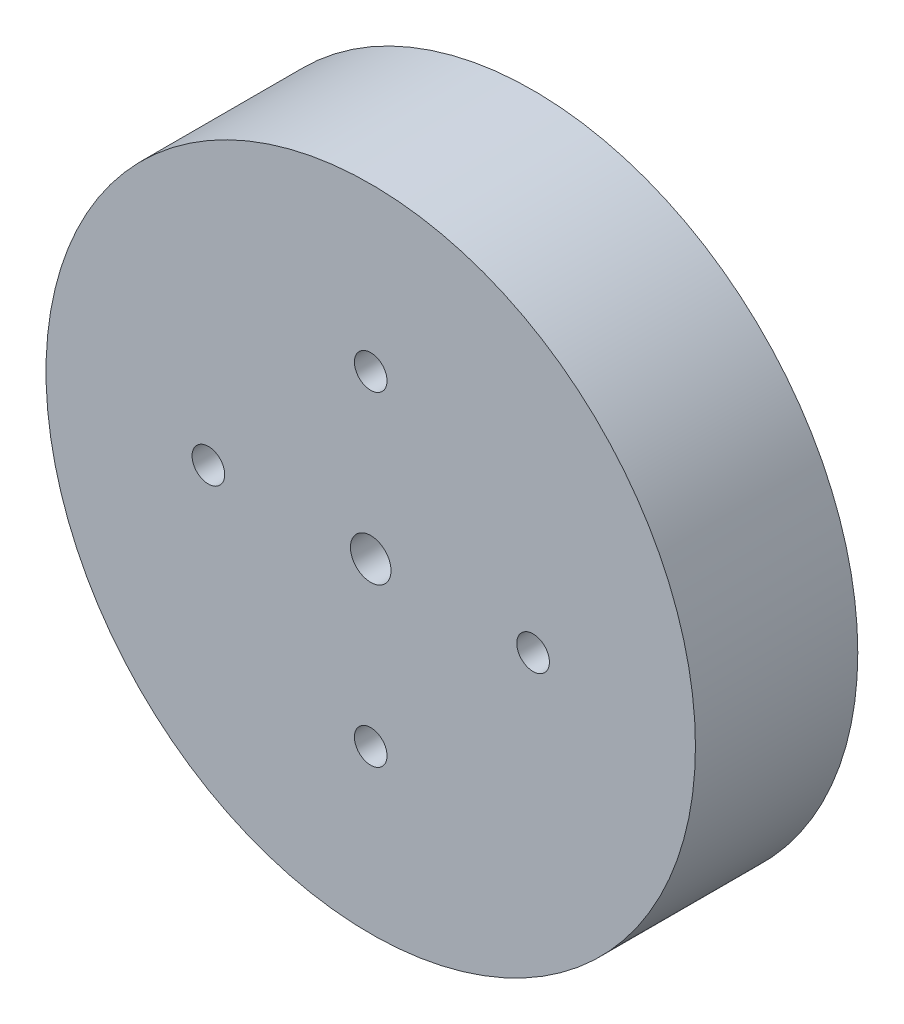
ISO-10303-21;
HEADER;
FILE_DESCRIPTION(('STEP AP214'),'2;1');
FILE_NAME('part.step','',(''),(''),'','','');
FILE_SCHEMA(('AUTOMOTIVE_DESIGN { 1 0 10303 214 1 1 1 1 }'));
ENDSEC;
DATA;
#1=APPLICATION_CONTEXT('core data for automotive mechanical design processes');
#2=APPLICATION_PROTOCOL_DEFINITION('international standard','automotive_design',2000,#1);
#3=PRODUCT_CONTEXT('',#1,'mechanical');
#4=PRODUCT('Part','Part','',(#3));
#5=PRODUCT_RELATED_PRODUCT_CATEGORY('part','',(#4));
#6=PRODUCT_DEFINITION_FORMATION('','',#4);
#7=PRODUCT_DEFINITION_CONTEXT('part definition',#1,'design');
#8=PRODUCT_DEFINITION('design','',#6,#7);
#9=PRODUCT_DEFINITION_SHAPE('','',#8);
#10=(LENGTH_UNIT() NAMED_UNIT(*) SI_UNIT(.MILLI.,.METRE.));
#11=(NAMED_UNIT(*) PLANE_ANGLE_UNIT() SI_UNIT($,.RADIAN.));
#12=(NAMED_UNIT(*) SI_UNIT($,.STERADIAN.) SOLID_ANGLE_UNIT());
#13=UNCERTAINTY_MEASURE_WITH_UNIT(LENGTH_MEASURE(1.E-05),#10,'distance_accuracy_value','');
#14=(GEOMETRIC_REPRESENTATION_CONTEXT(3) GLOBAL_UNCERTAINTY_ASSIGNED_CONTEXT((#13)) GLOBAL_UNIT_ASSIGNED_CONTEXT((#10,
#11,#12)) REPRESENTATION_CONTEXT('',''));
#15=CARTESIAN_POINT('',(0.,0.,0.));
#16=DIRECTION('',(0.,0.,1.));
#17=DIRECTION('',(1.,0.,0.));
#18=AXIS2_PLACEMENT_3D('',#15,#16,#17);
#19=CARTESIAN_POINT('',(0.,0.,25.4));
#20=DIRECTION('',(0.,0.,-1.));
#21=DIRECTION('',(-1.,0.,0.));
#22=AXIS2_PLACEMENT_3D('',#19,#20,#21);
#23=CYLINDRICAL_SURFACE('',#22,50.8);
#24=CARTESIAN_POINT('',(0.,0.,25.4));
#25=DIRECTION('',(0.,0.,1.));
#26=DIRECTION('',(1.,0.,0.));
#27=AXIS2_PLACEMENT_3D('',#24,#25,#26);
#28=CIRCLE('',#27,50.8);
#29=CARTESIAN_POINT('',(50.8,0.,25.4));
#30=VERTEX_POINT('',#29);
#31=EDGE_CURVE('E10',#30,#30,#28,.T.);
#32=ORIENTED_EDGE('',*,*,#31,.F.);
#33=EDGE_LOOP('',(#32));
#34=FACE_BOUND('',#33,.T.);
#35=CARTESIAN_POINT('',(0.,0.,0.));
#36=DIRECTION('',(0.,0.,1.));
#37=DIRECTION('',(1.,0.,0.));
#38=AXIS2_PLACEMENT_3D('',#35,#36,#37);
#39=CIRCLE('',#38,50.8);
#40=CARTESIAN_POINT('',(50.8,0.,0.));
#41=VERTEX_POINT('',#40);
#42=EDGE_CURVE('E35',#41,#41,#39,.T.);
#43=ORIENTED_EDGE('',*,*,#42,.T.);
#44=EDGE_LOOP('',(#43));
#45=FACE_BOUND('',#44,.T.);
#46=ADVANCED_FACE('F32',(#34,#45),#23,.T.);
#47=CARTESIAN_POINT('',(0.,0.,25.4));
#48=DIRECTION('',(0.,0.,1.));
#49=DIRECTION('',(1.,0.,0.));
#50=AXIS2_PLACEMENT_3D('',#47,#48,#49);
#51=PLANE('',#50);
#52=CARTESIAN_POINT('',(2.66051032116535E-13,25.4,25.4));
#53=DIRECTION('',(0.,0.,1.));
#54=DIRECTION('',(1.,0.,0.));
#55=AXIS2_PLACEMENT_3D('',#52,#53,#54);
#56=CIRCLE('',#55,2.55269999999999);
#57=CARTESIAN_POINT('',(2.55270000000025,25.4,25.4));
#58=VERTEX_POINT('',#57);
#59=EDGE_CURVE('E70',#58,#58,#56,.T.);
#60=ORIENTED_EDGE('',*,*,#59,.F.);
#61=EDGE_LOOP('',(#60));
#62=FACE_BOUND('',#61,.T.);
#63=CARTESIAN_POINT('',(-25.4,1.77367354744357E-13,25.4));
#64=DIRECTION('',(0.,0.,1.));
#65=DIRECTION('',(1.,0.,0.));
#66=AXIS2_PLACEMENT_3D('',#63,#64,#65);
#67=CIRCLE('',#66,2.55269999999999);
#68=CARTESIAN_POINT('',(-22.8473,1.77367354744357E-13,25.4));
#69=VERTEX_POINT('',#68);
#70=EDGE_CURVE('E64',#69,#69,#67,.T.);
#71=ORIENTED_EDGE('',*,*,#70,.F.);
#72=EDGE_LOOP('',(#71));
#73=FACE_BOUND('',#72,.T.);
#74=CARTESIAN_POINT('',(0.,-25.4,25.4));
#75=DIRECTION('',(0.,0.,1.));
#76=DIRECTION('',(1.,0.,0.));
#77=AXIS2_PLACEMENT_3D('',#74,#75,#76);
#78=CIRCLE('',#77,2.55269999999999);
#79=CARTESIAN_POINT('',(2.5526999999999,-25.4,25.4));
#80=VERTEX_POINT('',#79);
#81=EDGE_CURVE('E58',#80,#80,#78,.T.);
#82=ORIENTED_EDGE('',*,*,#81,.F.);
#83=EDGE_LOOP('',(#82));
#84=FACE_BOUND('',#83,.T.);
#85=CARTESIAN_POINT('',(25.4,0.,25.4));
#86=DIRECTION('',(0.,0.,1.));
#87=DIRECTION('',(1.,0.,0.));
#88=AXIS2_PLACEMENT_3D('',#85,#86,#87);
#89=CIRCLE('',#88,2.55269999999999);
#90=CARTESIAN_POINT('',(27.9527,0.,25.4));
#91=VERTEX_POINT('',#90);
#92=EDGE_CURVE('E52',#91,#91,#89,.T.);
#93=ORIENTED_EDGE('',*,*,#92,.F.);
#94=EDGE_LOOP('',(#93));
#95=FACE_BOUND('',#94,.T.);
#96=CARTESIAN_POINT('',(0.,0.,25.4));
#97=DIRECTION('',(0.,0.,1.));
#98=DIRECTION('',(1.,0.,0.));
#99=AXIS2_PLACEMENT_3D('',#96,#97,#98);
#100=CIRCLE('',#99,3.17499999999999);
#101=CARTESIAN_POINT('',(3.17499999999999,0.,25.4));
#102=VERTEX_POINT('',#101);
#103=EDGE_CURVE('E46',#102,#102,#100,.T.);
#104=ORIENTED_EDGE('',*,*,#103,.F.);
#105=EDGE_LOOP('',(#104));
#106=FACE_BOUND('',#105,.T.);
#107=ORIENTED_EDGE('',*,*,#31,.T.);
#108=EDGE_LOOP('',(#107));
#109=FACE_BOUND('',#108,.T.);
#110=ADVANCED_FACE('F76',(#62,#73,#84,#95,#106,#109),#51,.T.);
#111=CARTESIAN_POINT('',(0.,0.,0.));
#112=DIRECTION('',(0.,0.,1.));
#113=DIRECTION('',(1.,0.,0.));
#114=AXIS2_PLACEMENT_3D('',#111,#112,#113);
#115=PLANE('',#114);
#116=CARTESIAN_POINT('',(2.66051032116535E-13,25.4,0.));
#117=DIRECTION('',(0.,0.,1.));
#118=DIRECTION('',(1.,0.,0.));
#119=AXIS2_PLACEMENT_3D('',#116,#117,#118);
#120=CIRCLE('',#119,2.55269999999999);
#121=CARTESIAN_POINT('',(2.55270000000025,25.4,0.));
#122=VERTEX_POINT('',#121);
#123=EDGE_CURVE('E67',#122,#122,#120,.T.);
#124=ORIENTED_EDGE('',*,*,#123,.T.);
#125=EDGE_LOOP('',(#124));
#126=FACE_BOUND('',#125,.T.);
#127=CARTESIAN_POINT('',(-25.4,1.77367354744357E-13,0.));
#128=DIRECTION('',(0.,0.,1.));
#129=DIRECTION('',(1.,0.,0.));
#130=AXIS2_PLACEMENT_3D('',#127,#128,#129);
#131=CIRCLE('',#130,2.55269999999998);
#132=CARTESIAN_POINT('',(-22.8473,1.77367354744357E-13,0.));
#133=VERTEX_POINT('',#132);
#134=EDGE_CURVE('E61',#133,#133,#131,.T.);
#135=ORIENTED_EDGE('',*,*,#134,.T.);
#136=EDGE_LOOP('',(#135));
#137=FACE_BOUND('',#136,.T.);
#138=CARTESIAN_POINT('',(0.,-25.4,0.));
#139=DIRECTION('',(0.,0.,1.));
#140=DIRECTION('',(1.,0.,0.));
#141=AXIS2_PLACEMENT_3D('',#138,#139,#140);
#142=CIRCLE('',#141,2.55269999999999);
#143=CARTESIAN_POINT('',(2.5526999999999,-25.4,0.));
#144=VERTEX_POINT('',#143);
#145=EDGE_CURVE('E55',#144,#144,#142,.T.);
#146=ORIENTED_EDGE('',*,*,#145,.T.);
#147=EDGE_LOOP('',(#146));
#148=FACE_BOUND('',#147,.T.);
#149=CARTESIAN_POINT('',(25.4,0.,0.));
#150=DIRECTION('',(0.,0.,1.));
#151=DIRECTION('',(1.,0.,0.));
#152=AXIS2_PLACEMENT_3D('',#149,#150,#151);
#153=CIRCLE('',#152,2.55269999999998);
#154=CARTESIAN_POINT('',(27.9527,0.,0.));
#155=VERTEX_POINT('',#154);
#156=EDGE_CURVE('E49',#155,#155,#153,.T.);
#157=ORIENTED_EDGE('',*,*,#156,.T.);
#158=EDGE_LOOP('',(#157));
#159=FACE_BOUND('',#158,.T.);
#160=CARTESIAN_POINT('',(0.,0.,0.));
#161=DIRECTION('',(0.,0.,1.));
#162=DIRECTION('',(1.,0.,0.));
#163=AXIS2_PLACEMENT_3D('',#160,#161,#162);
#164=CIRCLE('',#163,3.175);
#165=CARTESIAN_POINT('',(3.175,0.,0.));
#166=VERTEX_POINT('',#165);
#167=EDGE_CURVE('E42',#166,#166,#164,.T.);
#168=ORIENTED_EDGE('',*,*,#167,.T.);
#169=EDGE_LOOP('',(#168));
#170=FACE_BOUND('',#169,.T.);
#171=ORIENTED_EDGE('',*,*,#42,.F.);
#172=EDGE_LOOP('',(#171));
#173=FACE_BOUND('',#172,.T.);
#174=ADVANCED_FACE('F79',(#126,#137,#148,#159,#170,#173),#115,.F.);
#175=CARTESIAN_POINT('',(0.,0.,25.4));
#176=DIRECTION('',(0.,0.,1.));
#177=DIRECTION('',(1.,0.,0.));
#178=AXIS2_PLACEMENT_3D('',#175,#176,#177);
#179=CYLINDRICAL_SURFACE('',#178,3.17499999999999);
#180=ORIENTED_EDGE('',*,*,#167,.F.);
#181=EDGE_LOOP('',(#180));
#182=FACE_BOUND('',#181,.T.);
#183=ORIENTED_EDGE('',*,*,#103,.T.);
#184=EDGE_LOOP('',(#183));
#185=FACE_BOUND('',#184,.T.);
#186=ADVANCED_FACE('F89',(#182,#185),#179,.F.);
#187=CARTESIAN_POINT('',(25.4,0.,25.4));
#188=DIRECTION('',(0.,0.,1.));
#189=DIRECTION('',(1.,0.,0.));
#190=AXIS2_PLACEMENT_3D('',#187,#188,#189);
#191=CYLINDRICAL_SURFACE('',#190,2.55269999999999);
#192=ORIENTED_EDGE('',*,*,#156,.F.);
#193=EDGE_LOOP('',(#192));
#194=FACE_BOUND('',#193,.T.);
#195=ORIENTED_EDGE('',*,*,#92,.T.);
#196=EDGE_LOOP('',(#195));
#197=FACE_BOUND('',#196,.T.);
#198=ADVANCED_FACE('F91',(#194,#197),#191,.F.);
#199=CARTESIAN_POINT('',(0.,-25.4,25.4));
#200=DIRECTION('',(0.,0.,1.));
#201=DIRECTION('',(1.,0.,0.));
#202=AXIS2_PLACEMENT_3D('',#199,#200,#201);
#203=CYLINDRICAL_SURFACE('',#202,2.55269999999999);
#204=ORIENTED_EDGE('',*,*,#145,.F.);
#205=EDGE_LOOP('',(#204));
#206=FACE_BOUND('',#205,.T.);
#207=ORIENTED_EDGE('',*,*,#81,.T.);
#208=EDGE_LOOP('',(#207));
#209=FACE_BOUND('',#208,.T.);
#210=ADVANCED_FACE('F98',(#206,#209),#203,.F.);
#211=CARTESIAN_POINT('',(-25.4,1.77367354744357E-13,25.4));
#212=DIRECTION('',(0.,0.,1.));
#213=DIRECTION('',(1.,0.,0.));
#214=AXIS2_PLACEMENT_3D('',#211,#212,#213);
#215=CYLINDRICAL_SURFACE('',#214,2.55269999999999);
#216=ORIENTED_EDGE('',*,*,#134,.F.);
#217=EDGE_LOOP('',(#216));
#218=FACE_BOUND('',#217,.T.);
#219=ORIENTED_EDGE('',*,*,#70,.T.);
#220=EDGE_LOOP('',(#219));
#221=FACE_BOUND('',#220,.T.);
#222=ADVANCED_FACE('F129',(#218,#221),#215,.F.);
#223=CARTESIAN_POINT('',(2.66051032116535E-13,25.4,25.4));
#224=DIRECTION('',(0.,0.,1.));
#225=DIRECTION('',(1.,0.,0.));
#226=AXIS2_PLACEMENT_3D('',#223,#224,#225);
#227=CYLINDRICAL_SURFACE('',#226,2.55269999999999);
#228=ORIENTED_EDGE('',*,*,#123,.F.);
#229=EDGE_LOOP('',(#228));
#230=FACE_BOUND('',#229,.T.);
#231=ORIENTED_EDGE('',*,*,#59,.T.);
#232=EDGE_LOOP('',(#231));
#233=FACE_BOUND('',#232,.T.);
#234=ADVANCED_FACE('F74',(#230,#233),#227,.F.);
#235=CLOSED_SHELL('',(#46,#110,#174,#186,#198,#210,#222,#234));
#236=MANIFOLD_SOLID_BREP('B2',#235);
#237=ADVANCED_BREP_SHAPE_REPRESENTATION('',(#18,#236),#14);
#238=SHAPE_DEFINITION_REPRESENTATION(#9,#237);
ENDSEC;
END-ISO-10303-21;
